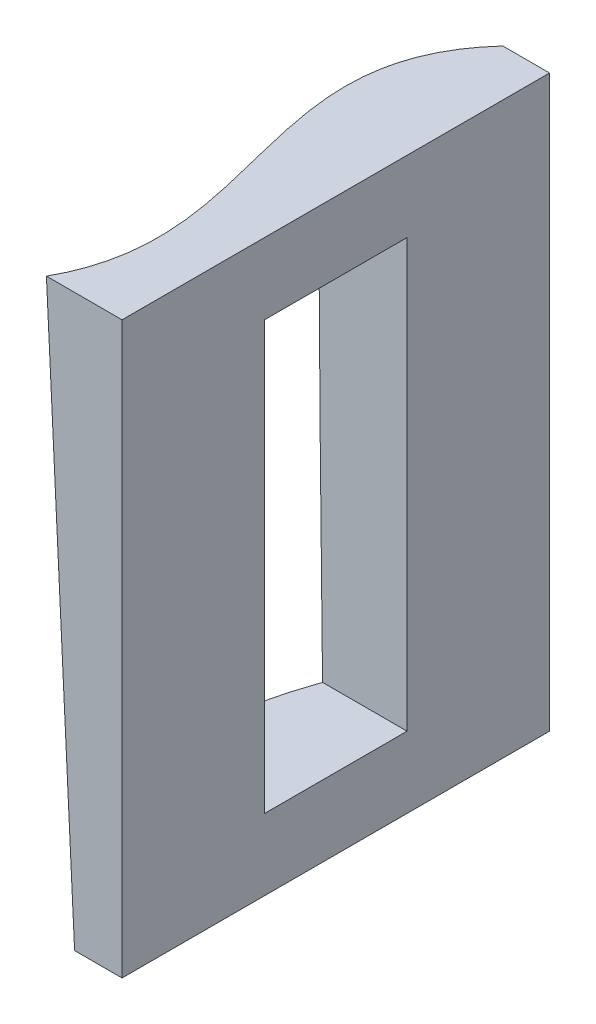
ISO-10303-21;
HEADER;
FILE_DESCRIPTION(('STEP AP214'),'2;1');
FILE_NAME('part.step','',(''),(''),'','','');
FILE_SCHEMA(('AUTOMOTIVE_DESIGN { 1 0 10303 214 1 1 1 1 }'));
ENDSEC;
DATA;
#1=APPLICATION_CONTEXT('core data for automotive mechanical design processes');
#2=APPLICATION_PROTOCOL_DEFINITION('international standard','automotive_design',2000,#1);
#3=PRODUCT_CONTEXT('',#1,'mechanical');
#4=PRODUCT('Part','Part','',(#3));
#5=PRODUCT_RELATED_PRODUCT_CATEGORY('part','',(#4));
#6=PRODUCT_DEFINITION_FORMATION('','',#4);
#7=PRODUCT_DEFINITION_CONTEXT('part definition',#1,'design');
#8=PRODUCT_DEFINITION('design','',#6,#7);
#9=PRODUCT_DEFINITION_SHAPE('','',#8);
#10=(LENGTH_UNIT() NAMED_UNIT(*) SI_UNIT(.MILLI.,.METRE.));
#11=(NAMED_UNIT(*) PLANE_ANGLE_UNIT() SI_UNIT($,.RADIAN.));
#12=(NAMED_UNIT(*) SI_UNIT($,.STERADIAN.) SOLID_ANGLE_UNIT());
#13=UNCERTAINTY_MEASURE_WITH_UNIT(LENGTH_MEASURE(1.E-05),#10,'distance_accuracy_value','');
#14=(GEOMETRIC_REPRESENTATION_CONTEXT(3) GLOBAL_UNCERTAINTY_ASSIGNED_CONTEXT((#13)) GLOBAL_UNIT_ASSIGNED_CONTEXT((#10,
#11,#12)) REPRESENTATION_CONTEXT('',''));
#15=CARTESIAN_POINT('',(0.,0.,0.));
#16=DIRECTION('',(0.,0.,1.));
#17=DIRECTION('',(1.,0.,0.));
#18=AXIS2_PLACEMENT_3D('',#15,#16,#17);
#19=CARTESIAN_POINT('',(0.,0.,0.));
#20=DIRECTION('',(-1.,0.,0.));
#21=DIRECTION('',(0.,0.,1.));
#22=AXIS2_PLACEMENT_3D('',#19,#20,#21);
#23=PLANE('',#22);
#24=DIRECTION('',(0.,1.,0.));
#25=VECTOR('',#24,1.);
#26=CARTESIAN_POINT('',(0.,-10.,7.5));
#27=LINE('',#26,#25);
#28=CARTESIAN_POINT('',(0.,-10.,7.5));
#29=VERTEX_POINT('',#28);
#30=CARTESIAN_POINT('',(0.,10.,7.5));
#31=VERTEX_POINT('',#30);
#32=EDGE_CURVE('E122',#29,#31,#27,.T.);
#33=ORIENTED_EDGE('',*,*,#32,.F.);
#34=DIRECTION('',(0.,0.,1.));
#35=VECTOR('',#34,1.);
#36=CARTESIAN_POINT('',(0.,-10.,-7.5));
#37=LINE('',#36,#35);
#38=CARTESIAN_POINT('',(0.,-10.,-7.5));
#39=VERTEX_POINT('',#38);
#40=EDGE_CURVE('E108',#39,#29,#37,.T.);
#41=ORIENTED_EDGE('',*,*,#40,.F.);
#42=DIRECTION('',(0.,-1.,0.));
#43=VECTOR('',#42,1.);
#44=CARTESIAN_POINT('',(0.,10.,-7.5));
#45=LINE('',#44,#43);
#46=CARTESIAN_POINT('',(0.,10.,-7.5));
#47=VERTEX_POINT('',#46);
#48=EDGE_CURVE('E141',#47,#39,#45,.T.);
#49=ORIENTED_EDGE('',*,*,#48,.F.);
#50=DIRECTION('',(0.,0.,-1.));
#51=VECTOR('',#50,1.);
#52=CARTESIAN_POINT('',(0.,10.,7.5));
#53=LINE('',#52,#51);
#54=EDGE_CURVE('E123',#31,#47,#53,.T.);
#55=ORIENTED_EDGE('',*,*,#54,.F.);
#56=EDGE_LOOP('',(#33,#41,#49,#55));
#57=FACE_BOUND('',#56,.T.);
#58=DIRECTION('',(0.,0.,1.));
#59=VECTOR('',#58,1.);
#60=CARTESIAN_POINT('',(0.,-7.5,-2.5));
#61=LINE('',#60,#59);
#62=CARTESIAN_POINT('',(0.,-7.5,-2.5));
#63=VERTEX_POINT('',#62);
#64=CARTESIAN_POINT('',(0.,-7.5,2.5));
#65=VERTEX_POINT('',#64);
#66=EDGE_CURVE('E147',#63,#65,#61,.T.);
#67=ORIENTED_EDGE('',*,*,#66,.T.);
#68=DIRECTION('',(0.,1.,0.));
#69=VECTOR('',#68,1.);
#70=CARTESIAN_POINT('',(0.,-7.5,2.5));
#71=LINE('',#70,#69);
#72=CARTESIAN_POINT('',(0.,7.5,2.5));
#73=VERTEX_POINT('',#72);
#74=EDGE_CURVE('E266',#65,#73,#71,.T.);
#75=ORIENTED_EDGE('',*,*,#74,.T.);
#76=DIRECTION('',(0.,0.,-1.));
#77=VECTOR('',#76,1.);
#78=CARTESIAN_POINT('',(0.,7.5,2.5));
#79=LINE('',#78,#77);
#80=CARTESIAN_POINT('',(0.,7.5,-2.5));
#81=VERTEX_POINT('',#80);
#82=EDGE_CURVE('E51',#73,#81,#79,.T.);
#83=ORIENTED_EDGE('',*,*,#82,.T.);
#84=DIRECTION('',(0.,-1.,0.));
#85=VECTOR('',#84,1.);
#86=CARTESIAN_POINT('',(0.,7.5,-2.5));
#87=LINE('',#86,#85);
#88=EDGE_CURVE('E11',#81,#63,#87,.T.);
#89=ORIENTED_EDGE('',*,*,#88,.T.);
#90=EDGE_LOOP('',(#67,#75,#83,#89));
#91=FACE_BOUND('',#90,.T.);
#92=ADVANCED_FACE('F43',(#57,#91),#23,.F.);
#93=CARTESIAN_POINT('',(0.,7.5,2.5));
#94=DIRECTION('',(0.,1.,0.));
#95=DIRECTION('',(0.,0.,1.));
#96=AXIS2_PLACEMENT_3D('',#93,#94,#95);
#97=PLANE('',#96);
#98=CARTESIAN_POINT('',(-2.23791618210378,7.5,2.49999999845518));
#99=CARTESIAN_POINT('',(-2.26807900408143,7.5,2.33328607018763));
#100=CARTESIAN_POINT('',(-2.30003529512361,7.5,2.16691714257089));
#101=CARTESIAN_POINT('',(-2.36636686924214,7.5,1.8347537169851));
#102=CARTESIAN_POINT('',(-2.40074082264732,7.5,1.66895895507478));
#103=CARTESIAN_POINT('',(-2.47076115397038,7.5,1.33771325640474));
#104=CARTESIAN_POINT('',(-2.50640701568265,7.5,1.1722622083604));
#105=CARTESIAN_POINT('',(-2.57785370656297,7.5,0.841465540605907));
#106=CARTESIAN_POINT('',(-2.61365446495109,7.5,0.676119905695233));
#107=CARTESIAN_POINT('',(-2.68428443663564,7.5,0.345297358249648));
#108=CARTESIAN_POINT('',(-2.71911408268759,7.5,0.179820539111591));
#109=CARTESIAN_POINT('',(-2.78670251052945,7.5,-0.15181445086051));
#110=CARTESIAN_POINT('',(-2.81945816463404,7.5,-0.317973266440065));
#111=CARTESIAN_POINT('',(-2.88160471332226,7.5,-0.650847854552647));
#112=CARTESIAN_POINT('',(-2.9109971861935,7.5,-0.81756332773708));
#113=CARTESIAN_POINT('',(-2.96505175117009,7.5,-1.15174601127623));
#114=CARTESIAN_POINT('',(-2.98971448387218,7.5,-1.31921311668097));
#115=CARTESIAN_POINT('',(-3.03338471723154,7.5,-1.65503143545074));
#116=CARTESIAN_POINT('',(-3.0523877563587,7.5,-1.8233832404038));
#117=CARTESIAN_POINT('',(-3.08383821274723,7.5,-2.16107835275083));
#118=CARTESIAN_POINT('',(-3.09627062670814,7.5,-2.33042304417805));
#119=CARTESIAN_POINT('',(-3.10493424993666,7.5,-2.49999999999958));
#120=B_SPLINE_CURVE_WITH_KNOTS('',3,(#98,#99,#100,#101,#102,#103,#104,#105,#106,#107,#108,#109,
#110,#111,#112,#113,#114,#115,#116,#117,#118,#119),.UNSPECIFIED.,.F.,.F.,(4,2,2,2,2,2,2,2,2,2,
4),(0.,0.508223830467439,1.0161703002038,1.52391291304327,2.031443906958,2.53874499352943,
3.04679373870504,3.55460307826067,4.06234359139284,4.5704833028126,5.07977833651671),.UNSPECIFIED.);
#121=CARTESIAN_POINT('',(-2.23791618196487,7.49999999998942,2.49999999922759));
#122=VERTEX_POINT('',#121);
#123=CARTESIAN_POINT('',(-3.10493424993105,7.499999999,-2.49999999999979));
#124=VERTEX_POINT('',#123);
#125=EDGE_CURVE('E183',#122,#124,#120,.T.);
#126=ORIENTED_EDGE('',*,*,#125,.T.);
#127=DIRECTION('',(-1.,0.,0.));
#128=VECTOR('',#127,1.);
#129=CARTESIAN_POINT('',(0.,7.5,-2.5));
#130=LINE('',#129,#128);
#131=EDGE_CURVE('E258',#81,#124,#130,.T.);
#132=ORIENTED_EDGE('',*,*,#131,.F.);
#133=ORIENTED_EDGE('',*,*,#82,.F.);
#134=DIRECTION('',(-1.,0.,0.));
#135=VECTOR('',#134,1.);
#136=CARTESIAN_POINT('',(0.,7.5,2.5));
#137=LINE('',#136,#135);
#138=EDGE_CURVE('E252',#73,#122,#137,.T.);
#139=ORIENTED_EDGE('',*,*,#138,.T.);
#140=EDGE_LOOP('',(#126,#132,#133,#139));
#141=FACE_BOUND('',#140,.T.);
#142=ADVANCED_FACE('F227',(#141),#97,.F.);
#143=CARTESIAN_POINT('',(0.,7.5,-2.5));
#144=DIRECTION('',(0.,0.,-1.));
#145=DIRECTION('',(-1.,0.,0.));
#146=AXIS2_PLACEMENT_3D('',#143,#144,#145);
#147=PLANE('',#146);
#148=CARTESIAN_POINT('',(-3.10493424992544,7.499999998,-2.5));
#149=CARTESIAN_POINT('',(-3.08946851061315,4.75304275318371,-2.5));
#150=CARTESIAN_POINT('',(-3.06851359452942,2.00613736703172,-2.5));
#151=CARTESIAN_POINT('',(-3.02037851406,-2.99384566537769,-2.5));
#152=CARTESIAN_POINT('',(-2.99499427800904,-5.24694027855904,-2.5));
#153=CARTESIAN_POINT('',(-2.96591679352136,-7.5,-2.5));
#154=B_SPLINE_CURVE_WITH_KNOTS('',3,(#148,#149,#150,#151,#152,#153),.UNSPECIFIED.,.F.,.F.,(4,2,
4),(0.,8.24095593853102,15.0006687474069),.UNSPECIFIED.);
#155=CARTESIAN_POINT('',(-2.96591679352136,-7.5,-2.5));
#156=VERTEX_POINT('',#155);
#157=EDGE_CURVE('E148',#124,#156,#154,.T.);
#158=ORIENTED_EDGE('',*,*,#157,.T.);
#159=DIRECTION('',(-1.,0.,0.));
#160=VECTOR('',#159,1.);
#161=CARTESIAN_POINT('',(0.,-7.5,-2.5));
#162=LINE('',#161,#160);
#163=EDGE_CURVE('E260',#63,#156,#162,.T.);
#164=ORIENTED_EDGE('',*,*,#163,.F.);
#165=ORIENTED_EDGE('',*,*,#88,.F.);
#166=ORIENTED_EDGE('',*,*,#131,.T.);
#167=EDGE_LOOP('',(#158,#164,#165,#166));
#168=FACE_BOUND('',#167,.T.);
#169=ADVANCED_FACE('F162',(#168),#147,.F.);
#170=CARTESIAN_POINT('',(0.,-7.5,2.5));
#171=DIRECTION('',(0.,0.,1.));
#172=DIRECTION('',(1.,0.,0.));
#173=AXIS2_PLACEMENT_3D('',#170,#171,#172);
#174=PLANE('',#173);
#175=CARTESIAN_POINT('',(-3.38119438346833,-7.499999998,2.5));
#176=CARTESIAN_POINT('',(-3.27693215253282,-6.13047310352526,2.5));
#177=CARTESIAN_POINT('',(-3.17258446811618,-4.760952721585,2.5));
#178=CARTESIAN_POINT('',(-2.96380402424506,-2.02191844162411,2.5));
#179=CARTESIAN_POINT('',(-2.8593712647906,-0.652404543603486,2.49999999999999));
#180=CARTESIAN_POINT('',(-2.66873411622145,1.84758853681497,2.5));
#181=CARTESIAN_POINT('',(-2.58252960652992,2.97806771008153,2.5));
#182=CARTESIAN_POINT('',(-2.41017180512759,5.23902996071196,2.5));
#183=CARTESIAN_POINT('',(-2.32401851341679,6.36951303807583,2.5));
#184=CARTESIAN_POINT('',(-2.23791618182595,7.49999999997884,2.5));
#185=B_SPLINE_CURVE_WITH_KNOTS('',3,(#175,#176,#177,#178,#179,#180,#181,#182,#183,#184),
.UNSPECIFIED.,.F.,.F.,(4,2,2,2,4),(0.,4.1204697122775,8.24093942442157,11.6422229181084,
15.0435064118861),.UNSPECIFIED.);
#186=CARTESIAN_POINT('',(-3.38119438354213,-7.499999999,2.50000000001313));
#187=VERTEX_POINT('',#186);
#188=EDGE_CURVE('E193',#187,#122,#185,.T.);
#189=ORIENTED_EDGE('',*,*,#188,.T.);
#190=ORIENTED_EDGE('',*,*,#138,.F.);
#191=ORIENTED_EDGE('',*,*,#74,.F.);
#192=DIRECTION('',(-1.,0.,0.));
#193=VECTOR('',#192,1.);
#194=CARTESIAN_POINT('',(0.,-7.5,2.5));
#195=LINE('',#194,#193);
#196=EDGE_CURVE('E133',#65,#187,#195,.T.);
#197=ORIENTED_EDGE('',*,*,#196,.T.);
#198=EDGE_LOOP('',(#189,#190,#191,#197));
#199=FACE_BOUND('',#198,.T.);
#200=ADVANCED_FACE('F222',(#199),#174,.F.);
#201=CARTESIAN_POINT('',(0.,-10.,-7.5));
#202=DIRECTION('',(0.,-1.,0.));
#203=DIRECTION('',(0.,0.,-1.));
#204=AXIS2_PLACEMENT_3D('',#201,#202,#203);
#205=PLANE('',#204);
#206=CARTESIAN_POINT('',(-2.85486258917261,-9.99999999999999,-7.49999999844175));
#207=CARTESIAN_POINT('',(-2.8157366041285,-10.,-7.44816857707123));
#208=CARTESIAN_POINT('',(-2.77769234234573,-10.,-7.39550686625245));
#209=CARTESIAN_POINT('',(-2.70397057328355,-10.,-7.28842544565743));
#210=CARTESIAN_POINT('',(-2.66829709006022,-10.,-7.23400296880933));
#211=CARTESIAN_POINT('',(-2.59963527700955,-10.,-7.12344802392635));
#212=CARTESIAN_POINT('',(-2.56664822772622,-10.,-7.06731475772561));
#213=CARTESIAN_POINT('',(-2.50356046140568,-10.,-6.95322134977815));
#214=CARTESIAN_POINT('',(-2.47346887023021,-10.,-6.89525615070076));
#215=CARTESIAN_POINT('',(-2.41657636853417,-10.,-6.77776072077581));
#216=CARTESIAN_POINT('',(-2.38977391874941,-10.,-6.71823123794598));
#217=CARTESIAN_POINT('',(-2.33970501197457,-10.,-6.59771776120493));
#218=CARTESIAN_POINT('',(-2.31643792849213,-10.,-6.53673402721862));
#219=CARTESIAN_POINT('',(-2.26266631226157,-10.,-6.38178657938556));
#220=CARTESIAN_POINT('',(-2.23458072041901,-10.,-6.28696842650623));
#221=CARTESIAN_POINT('',(-2.18751959996791,-10.,-6.09509365726557));
#222=CARTESIAN_POINT('',(-2.16854507233345,-10.,-5.99803679617882));
#223=CARTESIAN_POINT('',(-2.1398655670351,-10.,-5.80310111312259));
#224=CARTESIAN_POINT('',(-2.13011134292396,-10.,-5.70522950721957));
#225=CARTESIAN_POINT('',(-2.1193382752934,-10.,-5.50902616466129));
#226=CARTESIAN_POINT('',(-2.1183197734462,-9.99999999999999,-5.41069441015917));
#227=CARTESIAN_POINT('',(-2.12524206866184,-9.99999999999999,-5.18362601533668));
#228=CARTESIAN_POINT('',(-2.1360784909545,-10.,-5.05497886174454));
#229=CARTESIAN_POINT('',(-2.16938290657789,-10.,-4.79919534309424));
#230=CARTESIAN_POINT('',(-2.19185886172121,-10.,-4.67206007318485));
#231=CARTESIAN_POINT('',(-2.24636153623399,-10.,-4.41835802705737));
#232=CARTESIAN_POINT('',(-2.27849631991591,-10.,-4.29181506965152));
#233=CARTESIAN_POINT('',(-2.34987077657423,-10.,-4.04086620639946));
#234=CARTESIAN_POINT('',(-2.38910668157839,-10.,-3.91645920532649));
#235=CARTESIAN_POINT('',(-2.48939197936409,-10.,-3.61977296336135));
#236=CARTESIAN_POINT('',(-2.552874257604,-10.,-3.44832939044558));
#237=CARTESIAN_POINT('',(-2.68492267826145,-10.,-3.10740892871784));
#238=CARTESIAN_POINT('',(-2.75349052484587,-10.,-2.93793272137021));
#239=CARTESIAN_POINT('',(-2.8916021018424,-10.,-2.59920540651013));
#240=CARTESIAN_POINT('',(-2.96114666625103,-10.,-2.42995464589117));
#241=CARTESIAN_POINT('',(-3.0972882727176,-10.,-2.09002357845271));
#242=CARTESIAN_POINT('',(-3.16388208585255,-10.,-1.91934193736197));
#243=CARTESIAN_POINT('',(-3.25776930263755,-10.,-1.66306468553195));
#244=CARTESIAN_POINT('',(-3.28778345377952,-10.,-1.57847388012238));
#245=CARTESIAN_POINT('',(-3.34556260476416,-10.,-1.40852460938078));
#246=CARTESIAN_POINT('',(-3.37332763615089,-10.,-1.32316615483375));
#247=CARTESIAN_POINT('',(-3.42605529480353,-10.,-1.15164333109272));
#248=CARTESIAN_POINT('',(-3.45101980178748,-10.,-1.06547954503099));
#249=CARTESIAN_POINT('',(-3.49752060684656,-10.,-0.892230458270269));
#250=CARTESIAN_POINT('',(-3.51905703398016,-10.,-0.805145192394343));
#251=CARTESIAN_POINT('',(-3.55858198635084,-10.,-0.630293925823734));
#252=CARTESIAN_POINT('',(-3.57657513422207,-10.,-0.542528969422276));
#253=CARTESIAN_POINT('',(-3.60914194606233,-10.,-0.366367254690044));
#254=CARTESIAN_POINT('',(-3.62371541965171,-10.,-0.277970461465906));
#255=CARTESIAN_POINT('',(-3.66238382744715,-10.,-0.0121825366389599));
#256=CARTESIAN_POINT('',(-3.68146096915193,-10.,0.165959162760209));
#257=CARTESIAN_POINT('',(-3.70816018074844,-10.,0.539551475716102));
#258=CARTESIAN_POINT('',(-3.71456612940779,-10.,0.735085905441705));
#259=CARTESIAN_POINT('',(-3.71350889828366,-10.,1.12640582052131));
#260=CARTESIAN_POINT('',(-3.7060233147433,-10.,1.32219120164985));
#261=CARTESIAN_POINT('',(-3.67839759251577,-10.,1.71293807255951));
#262=CARTESIAN_POINT('',(-3.65825113504879,-10.,1.90789910198282));
#263=CARTESIAN_POINT('',(-3.60578992051571,-10.,2.30193103860172));
#264=CARTESIAN_POINT('',(-3.57313818796389,-10.,2.50095648896536));
#265=CARTESIAN_POINT('',(-3.49704528864241,-10.,2.89674472333233));
#266=CARTESIAN_POINT('',(-3.45361291512249,-10.,3.09350921530834));
#267=CARTESIAN_POINT('',(-3.35710209669081,-10.,3.48459442587624));
#268=CARTESIAN_POINT('',(-3.30402575984701,-9.99999999999999,3.67891566863069));
#269=CARTESIAN_POINT('',(-3.18223056742507,-9.99999999999999,4.08854035374248));
#270=CARTESIAN_POINT('',(-3.11239319643409,-10.,4.30351020352125));
#271=CARTESIAN_POINT('',(-2.96306640428661,-10.,4.73013453749285));
#272=CARTESIAN_POINT('',(-2.88357364189291,-10.,4.94178784523069));
#273=CARTESIAN_POINT('',(-2.71597414529005,-10.,5.36175756060642));
#274=CARTESIAN_POINT('',(-2.62786344368065,-10.,5.57007237947111));
#275=CARTESIAN_POINT('',(-2.44855656688155,-10.,5.97292455743469));
#276=CARTESIAN_POINT('',(-2.35773570149573,-10.,6.16762955157261));
#277=CARTESIAN_POINT('',(-2.16986139647299,-10.,6.55385557382773));
#278=CARTESIAN_POINT('',(-2.07281175776332,-10.,6.74537845557221));
#279=CARTESIAN_POINT('',(-1.87311155723776,-10.,7.12509443717966));
#280=CARTESIAN_POINT('',(-1.77047017445253,-10.,7.31329236019005));
#281=CARTESIAN_POINT('',(-1.66521732510748,-10.,7.49999999995771));
#282=B_SPLINE_CURVE_WITH_KNOTS('',3,(#206,#207,#208,#209,#210,#211,#212,#213,#214,#215,#216,
#217,#218,#219,#220,#221,#222,#223,#224,#225,#226,#227,#228,#229,#230,#231,#232,#233,#234,#235,
#236,#237,#238,#239,#240,#241,#242,#243,#244,#245,#246,#247,#248,#249,#250,#251,#252,#253,#254,
#255,#256,#257,#258,#259,#260,#261,#262,#263,#264,#265,#266,#267,#268,#269,#270,#271,#272,#273,
#274,#275,#276,#277,#278,#279,#280,#281),.UNSPECIFIED.,.F.,.F.,(4,2,2,2,2,2,2,2,2,2,2,2,2,2,2,2,
2,2,2,2,2,2,2,2,2,2,2,2,2,2,2,2,2,2,2,2,2,4),(0.,0.194825152733565,0.389972965655935,
0.58521326186976,0.781050032854449,0.976794803086141,1.17250484537987,1.46871498064193,
1.76495765116629,2.05960897145171,2.35427181610943,2.74090567328538,3.12780435039539,
3.51920389990566,3.91039637201478,4.45866528115011,5.00711875181758,5.55607307050371,
6.10561396405578,6.37486192563691,6.644106110342,6.91316848260779,7.18222072296507,
7.4509195923797,7.71963341721431,8.25659190902699,8.84297877130042,9.43031215890461,
10.0179389054722,10.6226622871512,11.2268940366453,11.8309938660433,12.5088200018888,
13.1868813705642,13.8652563777351,14.5096693534977,15.153692766545,15.7966891080853),.UNSPECIFIED.);
#283=CARTESIAN_POINT('',(-2.85486258975845,-9.99999999996338,-7.49999999922087));
#284=VERTEX_POINT('',#283);
#285=CARTESIAN_POINT('',(-1.66521732509556,-10.,7.49999999997885));
#286=VERTEX_POINT('',#285);
#287=EDGE_CURVE('E136',#284,#286,#282,.T.);
#288=ORIENTED_EDGE('',*,*,#287,.F.);
#289=DIRECTION('',(-1.,0.,0.));
#290=VECTOR('',#289,1.);
#291=CARTESIAN_POINT('',(0.,-10.,-7.5));
#292=LINE('',#291,#290);
#293=EDGE_CURVE('E115',#39,#284,#292,.T.);
#294=ORIENTED_EDGE('',*,*,#293,.F.);
#295=ORIENTED_EDGE('',*,*,#40,.T.);
#296=DIRECTION('',(-1.,0.,0.));
#297=VECTOR('',#296,1.);
#298=CARTESIAN_POINT('',(0.,-10.,7.5));
#299=LINE('',#298,#297);
#300=EDGE_CURVE('E113',#29,#286,#299,.T.);
#301=ORIENTED_EDGE('',*,*,#300,.T.);
#302=EDGE_LOOP('',(#288,#294,#295,#301));
#303=FACE_BOUND('',#302,.T.);
#304=ADVANCED_FACE('F111',(#303),#205,.T.);
#305=CARTESIAN_POINT('',(0.,10.,-7.5));
#306=DIRECTION('',(0.,0.,-1.));
#307=DIRECTION('',(-1.,0.,0.));
#308=AXIS2_PLACEMENT_3D('',#305,#306,#307);
#309=PLANE('',#308);
#310=CARTESIAN_POINT('',(-1.63958376305342,9.99999999799999,-7.5));
#311=CARTESIAN_POINT('',(-1.72021714862245,8.62887780575633,-7.5));
#312=CARTESIAN_POINT('',(-1.80146705193118,7.25779196093202,-7.5));
#313=CARTESIAN_POINT('',(-1.96511423840336,4.5156897060077,-7.5));
#314=CARTESIAN_POINT('',(-2.04751152075649,3.14467329585934,-7.5));
#315=CARTESIAN_POINT('',(-2.24914182265625,-0.188715966313053,-7.5));
#316=CARTESIAN_POINT('',(-2.36893170216749,-2.15105512997444,-7.5));
#317=CARTESIAN_POINT('',(-2.61047627761987,-6.0756145552556,-7.5));
#318=CARTESIAN_POINT('',(-2.73223097554702,-8.03783481675316,-7.5));
#319=CARTESIAN_POINT('',(-2.85486259034429,-9.99999999992677,-7.50000000000001));
#320=B_SPLINE_CURVE_WITH_KNOTS('',3,(#310,#311,#312,#313,#314,#315,#316,#317,#318,#319),
.UNSPECIFIED.,.F.,.F.,(4,2,2,2,4),(0.,4.12047303057291,8.24094315126259,14.1389181318891,
20.0368990744605),.UNSPECIFIED.);
#321=CARTESIAN_POINT('',(-1.63958376302138,9.999999999,-7.49999999997072));
#322=VERTEX_POINT('',#321);
#323=EDGE_CURVE('E119',#322,#284,#320,.T.);
#324=ORIENTED_EDGE('',*,*,#323,.F.);
#325=DIRECTION('',(-1.,0.,0.));
#326=VECTOR('',#325,1.);
#327=CARTESIAN_POINT('',(0.,10.,-7.5));
#328=LINE('',#327,#326);
#329=EDGE_CURVE('E138',#47,#322,#328,.T.);
#330=ORIENTED_EDGE('',*,*,#329,.F.);
#331=ORIENTED_EDGE('',*,*,#48,.T.);
#332=ORIENTED_EDGE('',*,*,#293,.T.);
#333=EDGE_LOOP('',(#324,#330,#331,#332));
#334=FACE_BOUND('',#333,.T.);
#335=ADVANCED_FACE('F215',(#334),#309,.T.);
#336=CARTESIAN_POINT('',(0.,-10.,7.5));
#337=DIRECTION('',(0.,0.,1.));
#338=DIRECTION('',(1.,0.,0.));
#339=AXIS2_PLACEMENT_3D('',#336,#337,#338);
#340=PLANE('',#339);
#341=DIRECTION('',(-0.0493702291330705,0.998780546704504,0.));
#342=VECTOR('',#341,1.);
#343=CARTESIAN_POINT('',(-1.66521732508364,-10.,7.5));
#344=LINE('',#343,#342);
#345=CARTESIAN_POINT('',(-2.65382747164623,10.,7.5));
#346=VERTEX_POINT('',#345);
#347=EDGE_CURVE('E46',#286,#346,#344,.T.);
#348=ORIENTED_EDGE('',*,*,#347,.F.);
#349=ORIENTED_EDGE('',*,*,#300,.F.);
#350=ORIENTED_EDGE('',*,*,#32,.T.);
#351=DIRECTION('',(-1.,0.,0.));
#352=VECTOR('',#351,1.);
#353=CARTESIAN_POINT('',(0.,10.,7.5));
#354=LINE('',#353,#352);
#355=EDGE_CURVE('E128',#31,#346,#354,.T.);
#356=ORIENTED_EDGE('',*,*,#355,.T.);
#357=EDGE_LOOP('',(#348,#349,#350,#356));
#358=FACE_BOUND('',#357,.T.);
#359=ADVANCED_FACE('F131',(#358),#340,.T.);
#360=CARTESIAN_POINT('',(4.16841450485184,13.0799216965068,-10.1707078270533));
#361=CARTESIAN_POINT('',(-9.80504219991242,-13.0799925528711,-11.0584422119017));
#362=CARTESIAN_POINT('',(-4.19043063306793,13.0799216965068,-7.60771543763683));
#363=CARTESIAN_POINT('',(1.50064569335801,-13.0799925528711,-7.03781992620204));
#364=CARTESIAN_POINT('',(-3.17651104997025,13.0799216965067,-0.538589627869607));
#365=CARTESIAN_POINT('',(-7.31491876274819,-13.079992552871,-0.761818588946082));
#366=CARTESIAN_POINT('',(0.234424958432416,13.0799216965068,6.92190617281059));
#367=CARTESIAN_POINT('',(-1.99949657295739,-13.0799925528711,7.7863329317207));
#368=CARTESIAN_POINT('',(-7.01205841196925,13.0799216965068,10.9714951368757));
#369=CARTESIAN_POINT('',(0.826158021089971,-13.0799925528711,9.79193021452965));
#370=B_SPLINE_SURFACE_WITH_KNOTS('',3,1,((#360,#361),(#362,#363),(#364,#365),(#366,#367),(#368,
#369)),.UNSPECIFIED.,.F.,.F.,.F.,(4,1,4),(2,2),(-0.20990793054294,0.43935988563207,
1.22388926701823),(-0.153996084825338,1.15399962764355),.UNSPECIFIED.);
#371=CARTESIAN_POINT('',(-2.96591679352136,-7.5,-2.5));
#372=CARTESIAN_POINT('',(-2.99873528253389,-7.5,-2.40426093103918));
#373=CARTESIAN_POINT('',(-3.03120541702712,-7.5,-2.30839285278303));
#374=CARTESIAN_POINT('',(-3.0948313132511,-7.5,-2.11618068091988));
#375=CARTESIAN_POINT('',(-3.12598654563465,-7.5,-2.01983641272161));
#376=CARTESIAN_POINT('',(-3.18636213605365,-7.5,-1.82645196361017));
#377=CARTESIAN_POINT('',(-3.21558091281272,-7.5,-1.72941128396397));
#378=CARTESIAN_POINT('',(-3.27138892054472,-7.5,-1.53458328103572));
#379=CARTESIAN_POINT('',(-3.29797843856327,-7.5,-1.43679604051682));
#380=CARTESIAN_POINT('',(-3.34782294966905,-7.5,-1.24046346420786));
#381=CARTESIAN_POINT('',(-3.37108112824318,-7.5,-1.14191894885947));
#382=CARTESIAN_POINT('',(-3.40293850292147,-7.5,-0.993454310459872));
#383=CARTESIAN_POINT('',(-3.41305273632034,-7.5,-0.94385759354183));
#384=CARTESIAN_POINT('',(-3.43220724385264,-7.5,-0.844457269614939));
#385=CARTESIAN_POINT('',(-3.44124751509745,-7.5,-0.794653662049989));
#386=CARTESIAN_POINT('',(-3.46637222221286,-7.5,-0.647466028854813));
#387=CARTESIAN_POINT('',(-3.48098983574374,-7.5,-0.549828055141676));
#388=CARTESIAN_POINT('',(-3.50637393557825,-7.5,-0.354052211353263));
#389=CARTESIAN_POINT('',(-3.51714018127191,-7.5,-0.255914310433911));
#390=CARTESIAN_POINT('',(-3.5349757930352,-7.5,-0.059353628171396));
#391=CARTESIAN_POINT('',(-3.5420470368717,-7.5,0.0390689828625832));
#392=CARTESIAN_POINT('',(-3.55266923001584,-7.5,0.236095473451158));
#393=CARTESIAN_POINT('',(-3.55622022729473,-7.5,0.334699350517252));
#394=CARTESIAN_POINT('',(-3.56185445870082,-7.5,0.630519093343353));
#395=CARTESIAN_POINT('',(-3.55892861029113,-7.49999999999999,0.827854341972856));
#396=CARTESIAN_POINT('',(-3.54634001167814,-7.5,1.10688304794754));
#397=CARTESIAN_POINT('',(-3.54160624996508,-7.5,1.18884557228438));
#398=CARTESIAN_POINT('',(-3.53017545097898,-7.5,1.35261934187986));
#399=CARTESIAN_POINT('',(-3.52347885501486,-7.5,1.43443061698808));
#400=CARTESIAN_POINT('',(-3.50822265462085,-7.5,1.59787252983013));
#401=CARTESIAN_POINT('',(-3.49966315496114,-7.5,1.67950317746181));
#402=CARTESIAN_POINT('',(-3.48067051972311,-7.5,1.84349211771573));
#403=CARTESIAN_POINT('',(-3.47021707713947,-7.5,1.92584805617516));
#404=CARTESIAN_POINT('',(-3.44760200161606,-7.5,2.09032436869652));
#405=CARTESIAN_POINT('',(-3.43544036264796,-7.5,2.17244474192609));
#406=CARTESIAN_POINT('',(-3.40950391025827,-7.5,2.33642242813779));
#407=CARTESIAN_POINT('',(-3.39572925436002,-7.5,2.41827976600648));
#408=CARTESIAN_POINT('',(-3.38119438361592,-7.5,2.50000000002625));
#409=B_SPLINE_CURVE_WITH_KNOTS('',3,(#371,#372,#373,#374,#375,#376,#377,#378,#379,#380,#381,
#382,#383,#384,#385,#386,#387,#388,#389,#390,#391,#392,#393,#394,#395,#396,#397,#398,#399,#400,
#401,#402,#403,#404,#405,#406,#407,#408),.UNSPECIFIED.,.F.,.F.,(4,2,2,2,2,2,2,2,2,2,2,2,2,2,2,2,
2,2,4),(0.,0.30363689365615,0.60739488025197,0.911397929611053,1.21536775313559,
1.51904494651375,1.67088674644366,1.82272895477262,2.11882027097832,2.41493008193477,
2.71088926582589,3.00684441655419,3.59842033702501,3.84470471370059,4.09093376006434,
4.33714896202045,4.58617981268216,4.8352115422099,5.0842189721514),.UNSPECIFIED.);
#410=EDGE_CURVE('E156',#156,#187,#409,.T.);
#411=CARTESIAN_POINT('',(-2.65382747164623,10.,7.5));
#412=CARTESIAN_POINT('',(-2.5963900188996,10.,7.39724913027426));
#413=CARTESIAN_POINT('',(-2.54181738406451,10.,7.29288497278223));
#414=CARTESIAN_POINT('',(-2.43873624935104,10.,7.08124608260019));
#415=CARTESIAN_POINT('',(-2.39022584232451,10.,6.97397227826213));
#416=CARTESIAN_POINT('',(-2.29957584651256,10.,6.75678604533272));
#417=CARTESIAN_POINT('',(-2.25743502058737,10.,6.64687413394902));
#418=CARTESIAN_POINT('',(-2.18032110611028,10.,6.42651322650046));
#419=CARTESIAN_POINT('',(-2.14524528839711,10.,6.31610015405924));
#420=CARTESIAN_POINT('',(-2.08151654331878,10.,6.09343505133851));
#421=CARTESIAN_POINT('',(-2.05286369048659,10.,5.98118299973545));
#422=CARTESIAN_POINT('',(-2.00193439366792,10.,5.75524999777603));
#423=CARTESIAN_POINT('',(-1.97965786031162,9.99999999999999,5.64156906747));
#424=CARTESIAN_POINT('',(-1.93635342101379,9.99999999999999,5.38358458180722));
#425=CARTESIAN_POINT('',(-1.91714263854263,10.,5.23897426406204));
#426=CARTESIAN_POINT('',(-1.8880103314717,10.,4.94878105557283));
#427=CARTESIAN_POINT('',(-1.87809271872002,10.,4.8031977812199));
#428=CARTESIAN_POINT('',(-1.8667975539473,10.,4.51169893499486));
#429=CARTESIAN_POINT('',(-1.86542097036424,10.,4.36578332731699));
#430=CARTESIAN_POINT('',(-1.87033980735111,10.,4.07334077640066));
#431=CARTESIAN_POINT('',(-1.87667505978842,10.,3.92681458803656));
#432=CARTESIAN_POINT('',(-1.89612463678739,10.,3.634256763792));
#433=CARTESIAN_POINT('',(-1.90923759658192,10.,3.4882250343031));
#434=CARTESIAN_POINT('',(-1.94127446196138,10.,3.19683313604173));
#435=CARTESIAN_POINT('',(-1.96019763346321,10.,3.05147288478588));
#436=CARTESIAN_POINT('',(-2.01704546247382,10.,2.6655084506112));
#437=CARTESIAN_POINT('',(-2.05925714556003,10.,2.42553984572279));
#438=CARTESIAN_POINT('',(-2.15305292999335,10.,1.94740294542609));
#439=CARTESIAN_POINT('',(-2.20464109265773,10.,1.70923547690417));
#440=CARTESIAN_POINT('',(-2.31345744084503,10.,1.23409554475212));
#441=CARTESIAN_POINT('',(-2.37068836047927,10.,0.997123719487316));
#442=CARTESIAN_POINT('',(-2.48729950870553,10.,0.523419367454488));
#443=CARTESIAN_POINT('',(-2.54668223678253,10.,0.286687470179674));
#444=CARTESIAN_POINT('',(-2.66399161694761,10.,-0.187008136772139));
#445=CARTESIAN_POINT('',(-2.72191903633085,10.,-0.423971652823868));
#446=CARTESIAN_POINT('',(-2.83267839800599,10.,-0.899057931511));
#447=CARTESIAN_POINT('',(-2.88551158200322,10.,-1.13718039671496));
#448=CARTESIAN_POINT('',(-2.97562368507808,10.,-1.58341228043515));
#449=CARTESIAN_POINT('',(-3.0140373617573,10.,-1.79128757744769));
#450=CARTESIAN_POINT('',(-3.08107751118241,10.,-2.20871421671992));
#451=CARTESIAN_POINT('',(-3.1097016006304,10.,-2.41826595442371));
#452=CARTESIAN_POINT('',(-3.15379288448884,10.,-2.83807008777931));
#453=CARTESIAN_POINT('',(-3.16930548859079,9.99999999999999,-3.04831751232622));
#454=CARTESIAN_POINT('',(-3.18383636820425,10.,-3.46936277276115));
#455=CARTESIAN_POINT('',(-3.18286652640202,10.,-3.6801601025934));
#456=CARTESIAN_POINT('',(-3.16654885881973,10.,-3.99540240558659));
#457=CARTESIAN_POINT('',(-3.15864273574853,10.,-4.10025437845275));
#458=CARTESIAN_POINT('',(-3.13752708108438,10.,-4.30943431841306));
#459=CARTESIAN_POINT('',(-3.12431756933334,10.,-4.41376228746622));
#460=CARTESIAN_POINT('',(-3.09229175869639,10.,-4.62155777535054));
#461=CARTESIAN_POINT('',(-3.07347548915174,10.,-4.72502529868168));
#462=CARTESIAN_POINT('',(-3.03000601864676,10.,-4.93081013290309));
#463=CARTESIAN_POINT('',(-3.00534859935984,10.,-5.03312655630057));
#464=CARTESIAN_POINT('',(-2.95009266144608,10.,-5.23615077705971));
#465=CARTESIAN_POINT('',(-2.91949387426454,10.,-5.33685850148407));
#466=CARTESIAN_POINT('',(-2.8523698550677,10.,-5.53625732025764));
#467=CARTESIAN_POINT('',(-2.81584575567696,9.99999999999999,-5.63494879596181));
#468=CARTESIAN_POINT('',(-2.73257674154123,9.99999999999999,-5.84088868479496));
#469=CARTESIAN_POINT('',(-2.68514567918451,10.,-5.94786030070739));
#470=CARTESIAN_POINT('',(-2.58340137390999,10.,-6.15851906924539));
#471=CARTESIAN_POINT('',(-2.52908569087789,10.,-6.2622050409737));
#472=CARTESIAN_POINT('',(-2.41399659632424,10.,-6.46600167533653));
#473=CARTESIAN_POINT('',(-2.35321942440987,10.,-6.56611021023185));
#474=CARTESIAN_POINT('',(-2.22531587086149,10.,-6.76317341134702));
#475=CARTESIAN_POINT('',(-2.1581480987612,10.,-6.86010115803955));
#476=CARTESIAN_POINT('',(-2.01844050691402,10.,-7.04991705159106));
#477=CARTESIAN_POINT('',(-1.94590330522922,10.,-7.14280713254806));
#478=CARTESIAN_POINT('',(-1.79613875266682,10.,-7.32445044142778));
#479=CARTESIAN_POINT('',(-1.71892008223147,10.,-7.41321081714359));
#480=CARTESIAN_POINT('',(-1.63958376298934,10.,-7.49999999994143));
#481=B_SPLINE_CURVE_WITH_KNOTS('',3,(#411,#412,#413,#414,#415,#416,#417,#418,#419,#420,#421,
#422,#423,#424,#425,#426,#427,#428,#429,#430,#431,#432,#433,#434,#435,#436,#437,#438,#439,#440,
#441,#442,#443,#444,#445,#446,#447,#448,#449,#450,#451,#452,#453,#454,#455,#456,#457,#458,#459,
#460,#461,#462,#463,#464,#465,#466,#467,#468,#469,#470,#471,#472,#473,#474,#475,#476,#477,#478,
#479,#480),.UNSPECIFIED.,.F.,.F.,(4,2,2,2,2,2,2,2,2,2,2,2,2,2,2,2,2,2,2,2,2,2,2,2,2,2,2,2,2,2,2,
2,2,2,4),(0.,0.353114578769938,0.706117788204955,1.05905234680819,1.40641060309201,
1.75377288996006,2.10113030799637,2.53843691218861,2.97592751275664,3.41346771797609,
3.85327745248892,4.29299866087762,4.73266433614821,5.46331541525023,6.19428372516003,
6.92560797156001,7.65781079823949,8.38961911374888,9.12124859973977,9.7552713062856,
10.3894482574485,11.0214197241488,11.6529356031318,11.9682717933277,12.2836068037472,
12.5989401639855,12.9145019477699,13.2300779985279,13.5455937977864,13.8963817966699,
14.2472944747414,14.5984125031256,14.9519835102488,15.3053832422602,15.6581466296963),.UNSPECIFIED.);
#482=EDGE_CURVE('E144',#346,#322,#481,.T.);
#483=ORIENTED_EDGE('',*,*,#157,.F.);
#484=ORIENTED_EDGE('',*,*,#125,.F.);
#485=ORIENTED_EDGE('',*,*,#188,.F.);
#486=ORIENTED_EDGE('',*,*,#410,.F.);
#487=EDGE_LOOP('',(#483,#484,#485,#486));
#488=FACE_BOUND('',#487,.T.);
#489=ORIENTED_EDGE('',*,*,#482,.T.);
#490=ORIENTED_EDGE('',*,*,#323,.T.);
#491=ORIENTED_EDGE('',*,*,#287,.T.);
#492=ORIENTED_EDGE('',*,*,#347,.T.);
#493=EDGE_LOOP('',(#489,#490,#491,#492));
#494=FACE_BOUND('',#493,.T.);
#495=ADVANCED_FACE('F165',(#488,#494),#370,.F.);
#496=CARTESIAN_POINT('',(0.,10.,7.5));
#497=DIRECTION('',(0.,1.,0.));
#498=DIRECTION('',(0.,0.,1.));
#499=AXIS2_PLACEMENT_3D('',#496,#497,#498);
#500=PLANE('',#499);
#501=ORIENTED_EDGE('',*,*,#482,.F.);
#502=ORIENTED_EDGE('',*,*,#355,.F.);
#503=ORIENTED_EDGE('',*,*,#54,.T.);
#504=ORIENTED_EDGE('',*,*,#329,.T.);
#505=EDGE_LOOP('',(#501,#502,#503,#504));
#506=FACE_BOUND('',#505,.T.);
#507=ADVANCED_FACE('F171',(#506),#500,.T.);
#508=CARTESIAN_POINT('',(0.,-7.5,-2.5));
#509=DIRECTION('',(0.,-1.,0.));
#510=DIRECTION('',(0.,0.,-1.));
#511=AXIS2_PLACEMENT_3D('',#508,#509,#510);
#512=PLANE('',#511);
#513=ORIENTED_EDGE('',*,*,#410,.T.);
#514=ORIENTED_EDGE('',*,*,#196,.F.);
#515=ORIENTED_EDGE('',*,*,#66,.F.);
#516=ORIENTED_EDGE('',*,*,#163,.T.);
#517=EDGE_LOOP('',(#513,#514,#515,#516));
#518=FACE_BOUND('',#517,.T.);
#519=ADVANCED_FACE('F228',(#518),#512,.F.);
#520=CLOSED_SHELL('',(#92,#142,#169,#200,#304,#335,#359,#495,#507,#519));
#521=MANIFOLD_SOLID_BREP('B2',#520);
#522=ADVANCED_BREP_SHAPE_REPRESENTATION('',(#18,#521),#14);
#523=SHAPE_DEFINITION_REPRESENTATION(#9,#522);
ENDSEC;
END-ISO-10303-21;
